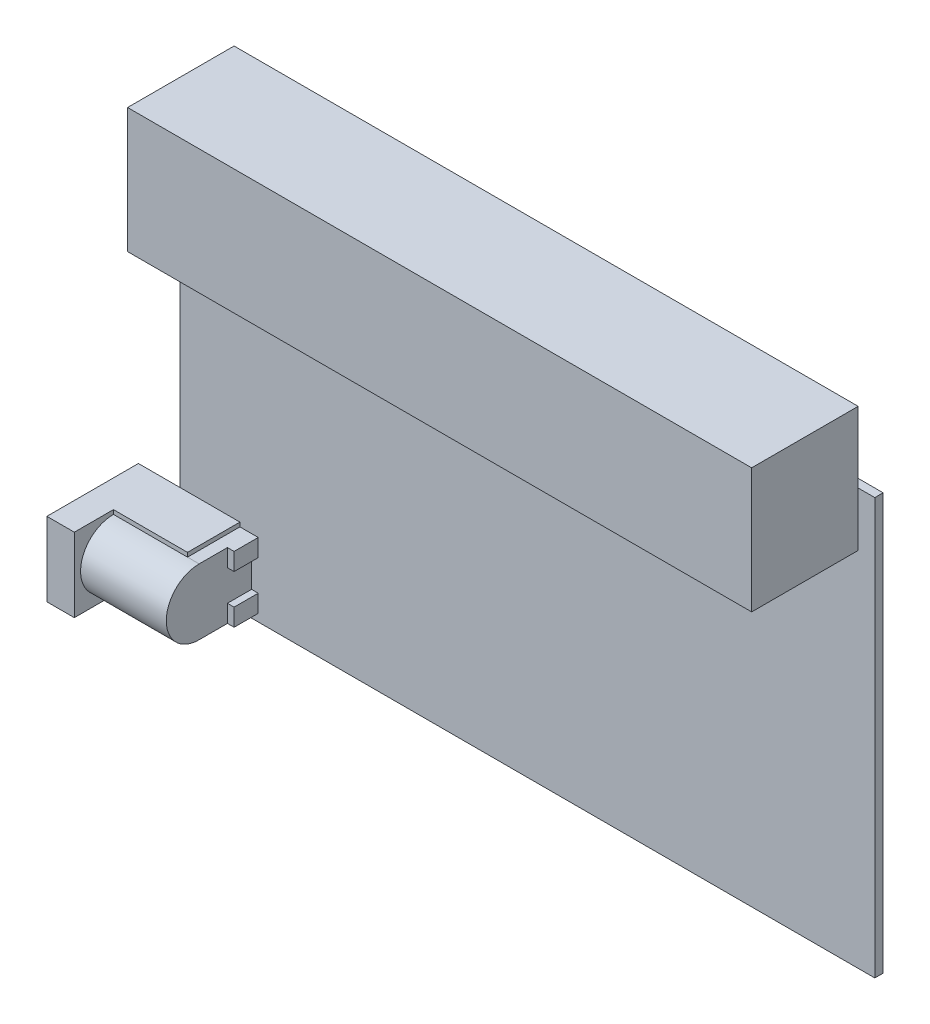
ISO-10303-21;
HEADER;
FILE_DESCRIPTION(('STEP AP214'),'2;1');
FILE_NAME('part.step','',(''),(''),'','','');
FILE_SCHEMA(('AUTOMOTIVE_DESIGN { 1 0 10303 214 1 1 1 1 }'));
ENDSEC;
DATA;
#1=APPLICATION_CONTEXT('core data for automotive mechanical design processes');
#2=APPLICATION_PROTOCOL_DEFINITION('international standard','automotive_design',2000,#1);
#3=PRODUCT_CONTEXT('',#1,'mechanical');
#4=PRODUCT('Part','Part','',(#3));
#5=PRODUCT_RELATED_PRODUCT_CATEGORY('part','',(#4));
#6=PRODUCT_DEFINITION_FORMATION('','',#4);
#7=PRODUCT_DEFINITION_CONTEXT('part definition',#1,'design');
#8=PRODUCT_DEFINITION('design','',#6,#7);
#9=PRODUCT_DEFINITION_SHAPE('','',#8);
#10=(LENGTH_UNIT() NAMED_UNIT(*) SI_UNIT(.MILLI.,.METRE.));
#11=(NAMED_UNIT(*) PLANE_ANGLE_UNIT() SI_UNIT($,.RADIAN.));
#12=(NAMED_UNIT(*) SI_UNIT($,.STERADIAN.) SOLID_ANGLE_UNIT());
#13=UNCERTAINTY_MEASURE_WITH_UNIT(LENGTH_MEASURE(1.E-05),#10,'distance_accuracy_value','');
#14=(GEOMETRIC_REPRESENTATION_CONTEXT(3) GLOBAL_UNCERTAINTY_ASSIGNED_CONTEXT((#13)) GLOBAL_UNIT_ASSIGNED_CONTEXT((#10,
#11,#12)) REPRESENTATION_CONTEXT('',''));
#15=CARTESIAN_POINT('',(0.,0.,0.));
#16=DIRECTION('',(0.,0.,1.));
#17=DIRECTION('',(1.,0.,0.));
#18=AXIS2_PLACEMENT_3D('',#15,#16,#17);
#19=CARTESIAN_POINT('',(0.,0.,1.));
#20=DIRECTION('',(0.,0.,1.));
#21=DIRECTION('',(1.,0.,0.));
#22=AXIS2_PLACEMENT_3D('',#19,#20,#21);
#23=PLANE('',#22);
#24=DIRECTION('',(0.,1.,0.));
#25=VECTOR('',#24,1.);
#26=CARTESIAN_POINT('',(-32.35,-18.3,1.));
#27=LINE('',#26,#25);
#28=CARTESIAN_POINT('',(-32.35,-18.3,1.));
#29=VERTEX_POINT('',#28);
#30=CARTESIAN_POINT('',(-32.35,-16.2,1.));
#31=VERTEX_POINT('',#30);
#32=EDGE_CURVE('E52',#29,#31,#27,.T.);
#33=ORIENTED_EDGE('',*,*,#32,.F.);
#34=DIRECTION('',(-1.,0.,0.));
#35=VECTOR('',#34,1.);
#36=CARTESIAN_POINT('',(-32.35,-18.3,1.));
#37=LINE('',#36,#35);
#38=CARTESIAN_POINT('',(-33.15,-18.3,1.));
#39=VERTEX_POINT('',#38);
#40=EDGE_CURVE('E222',#29,#39,#37,.T.);
#41=ORIENTED_EDGE('',*,*,#40,.T.);
#42=DIRECTION('',(0.,1.,0.));
#43=VECTOR('',#42,1.);
#44=CARTESIAN_POINT('',(-33.15,-16.2,1.));
#45=LINE('',#44,#43);
#46=CARTESIAN_POINT('',(-33.15,-22.,1.));
#47=VERTEX_POINT('',#46);
#48=EDGE_CURVE('E344',#47,#39,#45,.T.);
#49=ORIENTED_EDGE('',*,*,#48,.F.);
#50=DIRECTION('',(-1.,0.,0.));
#51=VECTOR('',#50,1.);
#52=CARTESIAN_POINT('',(-32.35,-22.,1.));
#53=LINE('',#52,#51);
#54=CARTESIAN_POINT('',(-32.35,-22.,1.));
#55=VERTEX_POINT('',#54);
#56=EDGE_CURVE('E263',#55,#47,#53,.T.);
#57=ORIENTED_EDGE('',*,*,#56,.F.);
#58=DIRECTION('',(0.,1.,0.));
#59=VECTOR('',#58,1.);
#60=CARTESIAN_POINT('',(-32.35,-22.,1.));
#61=LINE('',#60,#59);
#62=CARTESIAN_POINT('',(-32.35,-24.1,1.));
#63=VERTEX_POINT('',#62);
#64=EDGE_CURVE('E253',#63,#55,#61,.T.);
#65=ORIENTED_EDGE('',*,*,#64,.F.);
#66=DIRECTION('',(-1.,0.,0.));
#67=VECTOR('',#66,1.);
#68=CARTESIAN_POINT('',(-33.15,-24.1,1.));
#69=LINE('',#68,#67);
#70=CARTESIAN_POINT('',(-34.55,-24.1,1.));
#71=VERTEX_POINT('',#70);
#72=EDGE_CURVE('E355',#63,#71,#69,.T.);
#73=ORIENTED_EDGE('',*,*,#72,.T.);
#74=DIRECTION('',(0.,1.,0.));
#75=VECTOR('',#74,1.);
#76=CARTESIAN_POINT('',(-34.55,-24.6,1.));
#77=LINE('',#76,#75);
#78=CARTESIAN_POINT('',(-34.55,-24.6,1.));
#79=VERTEX_POINT('',#78);
#80=EDGE_CURVE('E305',#79,#71,#77,.T.);
#81=ORIENTED_EDGE('',*,*,#80,.F.);
#82=DIRECTION('',(1.,0.,0.));
#83=VECTOR('',#82,1.);
#84=CARTESIAN_POINT('',(-43.45,-24.6,1.));
#85=LINE('',#84,#83);
#86=CARTESIAN_POINT('',(-41.75,-24.6,1.));
#87=VERTEX_POINT('',#86);
#88=EDGE_CURVE('E292',#87,#79,#85,.T.);
#89=ORIENTED_EDGE('',*,*,#88,.F.);
#90=DIRECTION('',(0.,-1.,0.));
#91=VECTOR('',#90,1.);
#92=CARTESIAN_POINT('',(-41.75,25.,1.));
#93=LINE('',#92,#91);
#94=CARTESIAN_POINT('',(-41.75,-25.,1.));
#95=VERTEX_POINT('',#94);
#96=EDGE_CURVE('E398',#87,#95,#93,.T.);
#97=ORIENTED_EDGE('',*,*,#96,.T.);
#98=DIRECTION('',(1.,0.,0.));
#99=VECTOR('',#98,1.);
#100=CARTESIAN_POINT('',(-41.75,-25.,1.));
#101=LINE('',#100,#99);
#102=CARTESIAN_POINT('',(41.75,-25.,1.));
#103=VERTEX_POINT('',#102);
#104=EDGE_CURVE('E396',#95,#103,#101,.T.);
#105=ORIENTED_EDGE('',*,*,#104,.T.);
#106=DIRECTION('',(0.,1.,0.));
#107=VECTOR('',#106,1.);
#108=CARTESIAN_POINT('',(41.75,25.,1.));
#109=LINE('',#108,#107);
#110=CARTESIAN_POINT('',(41.75,25.,1.));
#111=VERTEX_POINT('',#110);
#112=EDGE_CURVE('E400',#103,#111,#109,.T.);
#113=ORIENTED_EDGE('',*,*,#112,.T.);
#114=DIRECTION('',(-1.,0.,0.));
#115=VECTOR('',#114,1.);
#116=CARTESIAN_POINT('',(-41.75,25.,1.));
#117=LINE('',#116,#115);
#118=CARTESIAN_POINT('',(39.75,25.,1.));
#119=VERTEX_POINT('',#118);
#120=EDGE_CURVE('E403',#111,#119,#117,.T.);
#121=ORIENTED_EDGE('',*,*,#120,.T.);
#122=DIRECTION('',(0.,1.,0.));
#123=VECTOR('',#122,1.);
#124=CARTESIAN_POINT('',(39.75,33.5,1.));
#125=LINE('',#124,#123);
#126=CARTESIAN_POINT('',(39.75,18.5,1.));
#127=VERTEX_POINT('',#126);
#128=EDGE_CURVE('E377',#127,#119,#125,.T.);
#129=ORIENTED_EDGE('',*,*,#128,.F.);
#130=DIRECTION('',(1.,0.,0.));
#131=VECTOR('',#130,1.);
#132=CARTESIAN_POINT('',(-35.25,18.5,1.));
#133=LINE('',#132,#131);
#134=CARTESIAN_POINT('',(-35.25,18.5,1.));
#135=VERTEX_POINT('',#134);
#136=EDGE_CURVE('E373',#135,#127,#133,.T.);
#137=ORIENTED_EDGE('',*,*,#136,.F.);
#138=DIRECTION('',(0.,-1.,0.));
#139=VECTOR('',#138,1.);
#140=CARTESIAN_POINT('',(-35.25,33.5,1.));
#141=LINE('',#140,#139);
#142=CARTESIAN_POINT('',(-35.25,25.,1.));
#143=VERTEX_POINT('',#142);
#144=EDGE_CURVE('E11',#143,#135,#141,.T.);
#145=ORIENTED_EDGE('',*,*,#144,.F.);
#146=CARTESIAN_POINT('',(-41.75,25.,1.));
#147=VERTEX_POINT('',#146);
#148=EDGE_CURVE('E402',#143,#147,#117,.T.);
#149=ORIENTED_EDGE('',*,*,#148,.T.);
#150=CARTESIAN_POINT('',(-41.75,-15.7,1.));
#151=VERTEX_POINT('',#150);
#152=EDGE_CURVE('E393',#147,#151,#93,.T.);
#153=ORIENTED_EDGE('',*,*,#152,.T.);
#154=DIRECTION('',(-1.,0.,0.));
#155=VECTOR('',#154,1.);
#156=CARTESIAN_POINT('',(0.,-15.7,1.));
#157=LINE('',#156,#155);
#158=CARTESIAN_POINT('',(-34.55,-15.7,1.));
#159=VERTEX_POINT('',#158);
#160=EDGE_CURVE('E276',#159,#151,#157,.T.);
#161=ORIENTED_EDGE('',*,*,#160,.F.);
#162=DIRECTION('',(0.,-1.,0.));
#163=VECTOR('',#162,1.);
#164=CARTESIAN_POINT('',(-34.55,-15.7,1.));
#165=LINE('',#164,#163);
#166=CARTESIAN_POINT('',(-34.55,-16.2,1.));
#167=VERTEX_POINT('',#166);
#168=EDGE_CURVE('E284',#159,#167,#165,.T.);
#169=ORIENTED_EDGE('',*,*,#168,.T.);
#170=DIRECTION('',(-1.,0.,0.));
#171=VECTOR('',#170,1.);
#172=CARTESIAN_POINT('',(-33.15,-16.2,1.));
#173=LINE('',#172,#171);
#174=EDGE_CURVE('E57',#31,#167,#173,.T.);
#175=ORIENTED_EDGE('',*,*,#174,.F.);
#176=EDGE_LOOP('',(#33,#41,#49,#57,#65,#73,#81,#89,#97,#105,#113,#121,#129,#137,#145,#149,#153,
#161,#169,#175));
#177=FACE_BOUND('',#176,.T.);
#178=ADVANCED_FACE('F35',(#177),#23,.T.);
#179=CARTESIAN_POINT('',(-33.15,-20.15,7.3));
#180=DIRECTION('',(-1.,0.,0.));
#181=DIRECTION('',(0.,0.,1.));
#182=AXIS2_PLACEMENT_3D('',#179,#180,#181);
#183=PLANE('',#182);
#184=DIRECTION('',(0.,-1.,0.));
#185=VECTOR('',#184,1.);
#186=CARTESIAN_POINT('',(-33.15,-18.3,3.9));
#187=LINE('',#186,#185);
#188=CARTESIAN_POINT('',(-33.15,-16.2,3.9));
#189=VERTEX_POINT('',#188);
#190=CARTESIAN_POINT('',(-33.15,-18.3,3.9));
#191=VERTEX_POINT('',#190);
#192=EDGE_CURVE('E237',#189,#191,#187,.T.);
#193=ORIENTED_EDGE('',*,*,#192,.F.);
#194=DIRECTION('',(0.,0.,1.));
#195=VECTOR('',#194,1.);
#196=CARTESIAN_POINT('',(-33.15,-16.2,7.3));
#197=LINE('',#196,#195);
#198=CARTESIAN_POINT('',(-33.15,-16.2,7.3));
#199=VERTEX_POINT('',#198);
#200=EDGE_CURVE('E347',#189,#199,#197,.T.);
#201=ORIENTED_EDGE('',*,*,#200,.T.);
#202=CARTESIAN_POINT('',(-33.15,-20.15,7.3));
#203=DIRECTION('',(1.,0.,0.));
#204=DIRECTION('',(0.,0.,1.));
#205=AXIS2_PLACEMENT_3D('',#202,#203,#204);
#206=CIRCLE('',#205,3.95);
#207=CARTESIAN_POINT('',(-33.15,-24.1,7.3));
#208=VERTEX_POINT('',#207);
#209=EDGE_CURVE('E339',#199,#208,#206,.T.);
#210=ORIENTED_EDGE('',*,*,#209,.T.);
#211=DIRECTION('',(0.,0.,-1.));
#212=VECTOR('',#211,1.);
#213=CARTESIAN_POINT('',(-33.15,-24.1,7.3));
#214=LINE('',#213,#212);
#215=CARTESIAN_POINT('',(-33.15,-24.1,3.9));
#216=VERTEX_POINT('',#215);
#217=EDGE_CURVE('E342',#208,#216,#214,.T.);
#218=ORIENTED_EDGE('',*,*,#217,.T.);
#219=DIRECTION('',(0.,-1.,0.));
#220=VECTOR('',#219,1.);
#221=CARTESIAN_POINT('',(-33.15,-22.,3.9));
#222=LINE('',#221,#220);
#223=CARTESIAN_POINT('',(-33.15,-22.,3.9));
#224=VERTEX_POINT('',#223);
#225=EDGE_CURVE('E238',#224,#216,#222,.T.);
#226=ORIENTED_EDGE('',*,*,#225,.F.);
#227=DIRECTION('',(0.,0.,1.));
#228=VECTOR('',#227,1.);
#229=CARTESIAN_POINT('',(-33.15,-22.,3.9));
#230=LINE('',#229,#228);
#231=EDGE_CURVE('E241',#47,#224,#230,.T.);
#232=ORIENTED_EDGE('',*,*,#231,.F.);
#233=ORIENTED_EDGE('',*,*,#48,.T.);
#234=DIRECTION('',(0.,0.,-1.));
#235=VECTOR('',#234,1.);
#236=CARTESIAN_POINT('',(-33.15,-18.3,3.9));
#237=LINE('',#236,#235);
#238=EDGE_CURVE('E233',#191,#39,#237,.T.);
#239=ORIENTED_EDGE('',*,*,#238,.F.);
#240=EDGE_LOOP('',(#193,#201,#210,#218,#226,#232,#233,#239));
#241=FACE_BOUND('',#240,.T.);
#242=ADVANCED_FACE('F482',(#241),#183,.F.);
#243=CARTESIAN_POINT('',(-43.45,0.,12.));
#244=DIRECTION('',(1.,0.,0.));
#245=DIRECTION('',(0.,0.,-1.));
#246=AXIS2_PLACEMENT_3D('',#243,#244,#245);
#247=PLANE('',#246);
#248=CARTESIAN_POINT('',(-43.45,-20.15,7.3));
#249=DIRECTION('',(1.,0.,0.));
#250=DIRECTION('',(0.,0.,1.));
#251=AXIS2_PLACEMENT_3D('',#248,#249,#250);
#252=CIRCLE('',#251,3.95);
#253=CARTESIAN_POINT('',(-43.45,-16.2,7.3));
#254=VERTEX_POINT('',#253);
#255=CARTESIAN_POINT('',(-43.45,-24.1,7.3));
#256=VERTEX_POINT('',#255);
#257=EDGE_CURVE('E338',#254,#256,#252,.T.);
#258=ORIENTED_EDGE('',*,*,#257,.F.);
#259=DIRECTION('',(0.,-1.,0.));
#260=VECTOR('',#259,1.);
#261=CARTESIAN_POINT('',(-43.45,-15.7,7.3));
#262=LINE('',#261,#260);
#263=CARTESIAN_POINT('',(-43.45,-15.7,7.3));
#264=VERTEX_POINT('',#263);
#265=EDGE_CURVE('E279',#264,#254,#262,.T.);
#266=ORIENTED_EDGE('',*,*,#265,.F.);
#267=DIRECTION('',(0.,0.,-1.));
#268=VECTOR('',#267,1.);
#269=CARTESIAN_POINT('',(-43.45,-15.7,12.));
#270=LINE('',#269,#268);
#271=CARTESIAN_POINT('',(-43.45,-15.7,12.));
#272=VERTEX_POINT('',#271);
#273=EDGE_CURVE('E335',#272,#264,#270,.T.);
#274=ORIENTED_EDGE('',*,*,#273,.F.);
#275=DIRECTION('',(0.,-1.,0.));
#276=VECTOR('',#275,1.);
#277=CARTESIAN_POINT('',(-43.45,0.,12.));
#278=LINE('',#277,#276);
#279=CARTESIAN_POINT('',(-43.45,-24.6,12.));
#280=VERTEX_POINT('',#279);
#281=EDGE_CURVE('E311',#272,#280,#278,.T.);
#282=ORIENTED_EDGE('',*,*,#281,.T.);
#283=DIRECTION('',(0.,0.,-1.));
#284=VECTOR('',#283,1.);
#285=CARTESIAN_POINT('',(-43.45,-24.6,12.));
#286=LINE('',#285,#284);
#287=CARTESIAN_POINT('',(-43.45,-24.6,7.3));
#288=VERTEX_POINT('',#287);
#289=EDGE_CURVE('E322',#280,#288,#286,.T.);
#290=ORIENTED_EDGE('',*,*,#289,.T.);
#291=DIRECTION('',(0.,1.,0.));
#292=VECTOR('',#291,1.);
#293=CARTESIAN_POINT('',(-43.45,-24.6,7.3));
#294=LINE('',#293,#292);
#295=EDGE_CURVE('E308',#288,#256,#294,.T.);
#296=ORIENTED_EDGE('',*,*,#295,.T.);
#297=EDGE_LOOP('',(#258,#266,#274,#282,#290,#296));
#298=FACE_BOUND('',#297,.T.);
#299=ADVANCED_FACE('F487',(#298),#247,.T.);
#300=CARTESIAN_POINT('',(-33.15,-16.2,7.3));
#301=DIRECTION('',(0.,-1.,0.));
#302=DIRECTION('',(0.,0.,-1.));
#303=AXIS2_PLACEMENT_3D('',#300,#301,#302);
#304=PLANE('',#303);
#305=DIRECTION('',(0.,0.,-1.));
#306=VECTOR('',#305,1.);
#307=CARTESIAN_POINT('',(-34.55,-16.2,0.));
#308=LINE('',#307,#306);
#309=CARTESIAN_POINT('',(-34.55,-16.2,7.3));
#310=VERTEX_POINT('',#309);
#311=EDGE_CURVE('E274',#310,#167,#308,.T.);
#312=ORIENTED_EDGE('',*,*,#311,.F.);
#313=DIRECTION('',(-1.,0.,0.));
#314=VECTOR('',#313,1.);
#315=CARTESIAN_POINT('',(-33.15,-16.2,7.3));
#316=LINE('',#315,#314);
#317=EDGE_CURVE('E349',#199,#310,#316,.T.);
#318=ORIENTED_EDGE('',*,*,#317,.F.);
#319=ORIENTED_EDGE('',*,*,#200,.F.);
#320=DIRECTION('',(-1.,0.,0.));
#321=VECTOR('',#320,1.);
#322=CARTESIAN_POINT('',(-32.35,-16.2,3.9));
#323=LINE('',#322,#321);
#324=CARTESIAN_POINT('',(-32.35,-16.2,3.9));
#325=VERTEX_POINT('',#324);
#326=EDGE_CURVE('E243',#325,#189,#323,.T.);
#327=ORIENTED_EDGE('',*,*,#326,.F.);
#328=DIRECTION('',(0.,0.,1.));
#329=VECTOR('',#328,1.);
#330=CARTESIAN_POINT('',(-32.35,-16.2,3.9));
#331=LINE('',#330,#329);
#332=EDGE_CURVE('E229',#31,#325,#331,.T.);
#333=ORIENTED_EDGE('',*,*,#332,.F.);
#334=ORIENTED_EDGE('',*,*,#174,.T.);
#335=EDGE_LOOP('',(#312,#318,#319,#327,#333,#334));
#336=FACE_BOUND('',#335,.T.);
#337=ADVANCED_FACE('F506',(#336),#304,.F.);
#338=CARTESIAN_POINT('',(-33.15,-24.1,7.3));
#339=DIRECTION('',(0.,1.,0.));
#340=DIRECTION('',(0.,0.,1.));
#341=AXIS2_PLACEMENT_3D('',#338,#339,#340);
#342=PLANE('',#341);
#343=DIRECTION('',(0.,0.,1.));
#344=VECTOR('',#343,1.);
#345=CARTESIAN_POINT('',(-34.55,-24.1,7.3));
#346=LINE('',#345,#344);
#347=CARTESIAN_POINT('',(-34.55,-24.1,7.3));
#348=VERTEX_POINT('',#347);
#349=EDGE_CURVE('E293',#71,#348,#346,.T.);
#350=ORIENTED_EDGE('',*,*,#349,.F.);
#351=ORIENTED_EDGE('',*,*,#72,.F.);
#352=DIRECTION('',(0.,0.,-1.));
#353=VECTOR('',#352,1.);
#354=CARTESIAN_POINT('',(-32.35,-24.1,3.9));
#355=LINE('',#354,#353);
#356=CARTESIAN_POINT('',(-32.35,-24.1,3.9));
#357=VERTEX_POINT('',#356);
#358=EDGE_CURVE('E250',#357,#63,#355,.T.);
#359=ORIENTED_EDGE('',*,*,#358,.F.);
#360=DIRECTION('',(-1.,0.,0.));
#361=VECTOR('',#360,1.);
#362=CARTESIAN_POINT('',(-32.35,-24.1,3.9));
#363=LINE('',#362,#361);
#364=EDGE_CURVE('E266',#357,#216,#363,.T.);
#365=ORIENTED_EDGE('',*,*,#364,.T.);
#366=ORIENTED_EDGE('',*,*,#217,.F.);
#367=DIRECTION('',(-1.,0.,0.));
#368=VECTOR('',#367,1.);
#369=CARTESIAN_POINT('',(-33.15,-24.1,7.3));
#370=LINE('',#369,#368);
#371=EDGE_CURVE('E358',#208,#348,#370,.T.);
#372=ORIENTED_EDGE('',*,*,#371,.T.);
#373=EDGE_LOOP('',(#350,#351,#359,#365,#366,#372));
#374=FACE_BOUND('',#373,.T.);
#375=ADVANCED_FACE('F502',(#374),#342,.F.);
#376=CARTESIAN_POINT('',(-41.75,25.,1.));
#377=DIRECTION('',(1.,0.,0.));
#378=DIRECTION('',(0.,1.,0.));
#379=AXIS2_PLACEMENT_3D('',#376,#377,#378);
#380=PLANE('',#379);
#381=DIRECTION('',(0.,-1.,0.));
#382=VECTOR('',#381,1.);
#383=CARTESIAN_POINT('',(-41.75,25.,0.));
#384=LINE('',#383,#382);
#385=CARTESIAN_POINT('',(-41.75,25.,0.));
#386=VERTEX_POINT('',#385);
#387=CARTESIAN_POINT('',(-41.75,-25.,0.));
#388=VERTEX_POINT('',#387);
#389=EDGE_CURVE('E392',#386,#388,#384,.T.);
#390=ORIENTED_EDGE('',*,*,#389,.T.);
#391=DIRECTION('',(0.,0.,-1.));
#392=VECTOR('',#391,1.);
#393=CARTESIAN_POINT('',(-41.75,-25.,1.));
#394=LINE('',#393,#392);
#395=EDGE_CURVE('E39',#95,#388,#394,.T.);
#396=ORIENTED_EDGE('',*,*,#395,.F.);
#397=ORIENTED_EDGE('',*,*,#96,.F.);
#398=EDGE_CURVE('E397',#151,#87,#93,.T.);
#399=ORIENTED_EDGE('',*,*,#398,.F.);
#400=ORIENTED_EDGE('',*,*,#152,.F.);
#401=DIRECTION('',(0.,0.,-1.));
#402=VECTOR('',#401,1.);
#403=CARTESIAN_POINT('',(-41.75,25.,1.));
#404=LINE('',#403,#402);
#405=EDGE_CURVE('E406',#147,#386,#404,.T.);
#406=ORIENTED_EDGE('',*,*,#405,.T.);
#407=EDGE_LOOP('',(#390,#396,#397,#399,#400,#406));
#408=FACE_BOUND('',#407,.T.);
#409=ADVANCED_FACE('F37',(#408),#380,.F.);
#410=CARTESIAN_POINT('',(-41.75,-25.,1.));
#411=DIRECTION('',(0.,1.,0.));
#412=DIRECTION('',(0.,0.,1.));
#413=AXIS2_PLACEMENT_3D('',#410,#411,#412);
#414=PLANE('',#413);
#415=DIRECTION('',(1.,0.,0.));
#416=VECTOR('',#415,1.);
#417=CARTESIAN_POINT('',(-41.75,-25.,0.));
#418=LINE('',#417,#416);
#419=CARTESIAN_POINT('',(41.75,-25.,0.));
#420=VERTEX_POINT('',#419);
#421=EDGE_CURVE('E410',#388,#420,#418,.T.);
#422=ORIENTED_EDGE('',*,*,#421,.T.);
#423=DIRECTION('',(0.,0.,-1.));
#424=VECTOR('',#423,1.);
#425=CARTESIAN_POINT('',(41.75,-25.,1.));
#426=LINE('',#425,#424);
#427=EDGE_CURVE('E420',#103,#420,#426,.T.);
#428=ORIENTED_EDGE('',*,*,#427,.F.);
#429=ORIENTED_EDGE('',*,*,#104,.F.);
#430=ORIENTED_EDGE('',*,*,#395,.T.);
#431=EDGE_LOOP('',(#422,#428,#429,#430));
#432=FACE_BOUND('',#431,.T.);
#433=ADVANCED_FACE('F430',(#432),#414,.F.);
#434=CARTESIAN_POINT('',(41.75,25.,1.));
#435=DIRECTION('',(-1.,0.,0.));
#436=DIRECTION('',(0.,-1.,0.));
#437=AXIS2_PLACEMENT_3D('',#434,#435,#436);
#438=PLANE('',#437);
#439=DIRECTION('',(0.,1.,0.));
#440=VECTOR('',#439,1.);
#441=CARTESIAN_POINT('',(41.75,25.,0.));
#442=LINE('',#441,#440);
#443=CARTESIAN_POINT('',(41.75,25.,0.));
#444=VERTEX_POINT('',#443);
#445=EDGE_CURVE('E412',#420,#444,#442,.T.);
#446=ORIENTED_EDGE('',*,*,#445,.T.);
#447=DIRECTION('',(0.,0.,-1.));
#448=VECTOR('',#447,1.);
#449=CARTESIAN_POINT('',(41.75,25.,1.));
#450=LINE('',#449,#448);
#451=EDGE_CURVE('E418',#111,#444,#450,.T.);
#452=ORIENTED_EDGE('',*,*,#451,.F.);
#453=ORIENTED_EDGE('',*,*,#112,.F.);
#454=ORIENTED_EDGE('',*,*,#427,.T.);
#455=EDGE_LOOP('',(#446,#452,#453,#454));
#456=FACE_BOUND('',#455,.T.);
#457=ADVANCED_FACE('F440',(#456),#438,.F.);
#458=CARTESIAN_POINT('',(-41.75,25.,1.));
#459=DIRECTION('',(0.,-1.,0.));
#460=DIRECTION('',(1.,0.,0.));
#461=AXIS2_PLACEMENT_3D('',#458,#459,#460);
#462=PLANE('',#461);
#463=DIRECTION('',(-1.,0.,0.));
#464=VECTOR('',#463,1.);
#465=CARTESIAN_POINT('',(-41.75,25.,0.));
#466=LINE('',#465,#464);
#467=EDGE_CURVE('E414',#444,#386,#466,.T.);
#468=ORIENTED_EDGE('',*,*,#467,.T.);
#469=ORIENTED_EDGE('',*,*,#405,.F.);
#470=ORIENTED_EDGE('',*,*,#148,.F.);
#471=EDGE_CURVE('E407',#119,#143,#117,.T.);
#472=ORIENTED_EDGE('',*,*,#471,.F.);
#473=ORIENTED_EDGE('',*,*,#120,.F.);
#474=ORIENTED_EDGE('',*,*,#451,.T.);
#475=EDGE_LOOP('',(#468,#469,#470,#472,#473,#474));
#476=FACE_BOUND('',#475,.T.);
#477=ADVANCED_FACE('F443',(#476),#462,.F.);
#478=CARTESIAN_POINT('',(0.,0.,0.));
#479=DIRECTION('',(0.,0.,1.));
#480=DIRECTION('',(1.,0.,0.));
#481=AXIS2_PLACEMENT_3D('',#478,#479,#480);
#482=PLANE('',#481);
#483=ORIENTED_EDGE('',*,*,#389,.F.);
#484=ORIENTED_EDGE('',*,*,#467,.F.);
#485=ORIENTED_EDGE('',*,*,#445,.F.);
#486=ORIENTED_EDGE('',*,*,#421,.F.);
#487=EDGE_LOOP('',(#483,#484,#485,#486));
#488=FACE_BOUND('',#487,.T.);
#489=ADVANCED_FACE('F438',(#488),#482,.F.);
#490=CARTESIAN_POINT('',(0.,0.,1.));
#491=DIRECTION('',(0.,0.,1.));
#492=DIRECTION('',(1.,0.,0.));
#493=AXIS2_PLACEMENT_3D('',#490,#491,#492);
#494=PLANE('',#493);
#495=CARTESIAN_POINT('',(39.75,33.5,1.));
#496=VERTEX_POINT('',#495);
#497=EDGE_CURVE('E376',#119,#496,#125,.T.);
#498=ORIENTED_EDGE('',*,*,#497,.F.);
#499=ORIENTED_EDGE('',*,*,#471,.T.);
#500=CARTESIAN_POINT('',(-35.25,33.5,1.));
#501=VERTEX_POINT('',#500);
#502=EDGE_CURVE('E45',#501,#143,#141,.T.);
#503=ORIENTED_EDGE('',*,*,#502,.F.);
#504=DIRECTION('',(-1.,0.,0.));
#505=VECTOR('',#504,1.);
#506=CARTESIAN_POINT('',(-35.25,33.5,1.));
#507=LINE('',#506,#505);
#508=EDGE_CURVE('E365',#496,#501,#507,.T.);
#509=ORIENTED_EDGE('',*,*,#508,.F.);
#510=EDGE_LOOP('',(#498,#499,#503,#509));
#511=FACE_BOUND('',#510,.T.);
#512=ADVANCED_FACE('F449',(#511),#494,.F.);
#513=CARTESIAN_POINT('',(-35.25,33.5,13.8));
#514=DIRECTION('',(1.,0.,0.));
#515=DIRECTION('',(0.,0.,-1.));
#516=AXIS2_PLACEMENT_3D('',#513,#514,#515);
#517=PLANE('',#516);
#518=ORIENTED_EDGE('',*,*,#502,.T.);
#519=ORIENTED_EDGE('',*,*,#144,.T.);
#520=DIRECTION('',(0.,0.,-1.));
#521=VECTOR('',#520,1.);
#522=CARTESIAN_POINT('',(-35.25,18.5,13.8));
#523=LINE('',#522,#521);
#524=CARTESIAN_POINT('',(-35.25,18.5,13.8));
#525=VERTEX_POINT('',#524);
#526=EDGE_CURVE('E389',#525,#135,#523,.T.);
#527=ORIENTED_EDGE('',*,*,#526,.F.);
#528=DIRECTION('',(0.,-1.,0.));
#529=VECTOR('',#528,1.);
#530=CARTESIAN_POINT('',(-35.25,33.5,13.8));
#531=LINE('',#530,#529);
#532=CARTESIAN_POINT('',(-35.25,33.5,13.8));
#533=VERTEX_POINT('',#532);
#534=EDGE_CURVE('E361',#533,#525,#531,.T.);
#535=ORIENTED_EDGE('',*,*,#534,.F.);
#536=DIRECTION('',(0.,0.,-1.));
#537=VECTOR('',#536,1.);
#538=CARTESIAN_POINT('',(-35.25,33.5,13.8));
#539=LINE('',#538,#537);
#540=EDGE_CURVE('E370',#533,#501,#539,.T.);
#541=ORIENTED_EDGE('',*,*,#540,.T.);
#542=EDGE_LOOP('',(#518,#519,#527,#535,#541));
#543=FACE_BOUND('',#542,.T.);
#544=ADVANCED_FACE('F460',(#543),#517,.F.);
#545=CARTESIAN_POINT('',(-35.25,18.5,13.8));
#546=DIRECTION('',(0.,1.,0.));
#547=DIRECTION('',(0.,0.,1.));
#548=AXIS2_PLACEMENT_3D('',#545,#546,#547);
#549=PLANE('',#548);
#550=ORIENTED_EDGE('',*,*,#136,.T.);
#551=DIRECTION('',(0.,0.,-1.));
#552=VECTOR('',#551,1.);
#553=CARTESIAN_POINT('',(39.75,18.5,13.8));
#554=LINE('',#553,#552);
#555=CARTESIAN_POINT('',(39.75,18.5,13.8));
#556=VERTEX_POINT('',#555);
#557=EDGE_CURVE('E386',#556,#127,#554,.T.);
#558=ORIENTED_EDGE('',*,*,#557,.F.);
#559=DIRECTION('',(1.,0.,0.));
#560=VECTOR('',#559,1.);
#561=CARTESIAN_POINT('',(-35.25,18.5,13.8));
#562=LINE('',#561,#560);
#563=EDGE_CURVE('E364',#525,#556,#562,.T.);
#564=ORIENTED_EDGE('',*,*,#563,.F.);
#565=ORIENTED_EDGE('',*,*,#526,.T.);
#566=EDGE_LOOP('',(#550,#558,#564,#565));
#567=FACE_BOUND('',#566,.T.);
#568=ADVANCED_FACE('F457',(#567),#549,.F.);
#569=CARTESIAN_POINT('',(39.75,33.5,13.8));
#570=DIRECTION('',(-1.,0.,0.));
#571=DIRECTION('',(0.,-1.,0.));
#572=AXIS2_PLACEMENT_3D('',#569,#570,#571);
#573=PLANE('',#572);
#574=ORIENTED_EDGE('',*,*,#128,.T.);
#575=ORIENTED_EDGE('',*,*,#497,.T.);
#576=DIRECTION('',(0.,0.,-1.));
#577=VECTOR('',#576,1.);
#578=CARTESIAN_POINT('',(39.75,33.5,13.8));
#579=LINE('',#578,#577);
#580=CARTESIAN_POINT('',(39.75,33.5,13.8));
#581=VERTEX_POINT('',#580);
#582=EDGE_CURVE('E383',#581,#496,#579,.T.);
#583=ORIENTED_EDGE('',*,*,#582,.F.);
#584=DIRECTION('',(0.,1.,0.));
#585=VECTOR('',#584,1.);
#586=CARTESIAN_POINT('',(39.75,33.5,13.8));
#587=LINE('',#586,#585);
#588=EDGE_CURVE('E367',#556,#581,#587,.T.);
#589=ORIENTED_EDGE('',*,*,#588,.F.);
#590=ORIENTED_EDGE('',*,*,#557,.T.);
#591=EDGE_LOOP('',(#574,#575,#583,#589,#590));
#592=FACE_BOUND('',#591,.T.);
#593=ADVANCED_FACE('F453',(#592),#573,.F.);
#594=CARTESIAN_POINT('',(-35.25,33.5,13.8));
#595=DIRECTION('',(0.,-1.,0.));
#596=DIRECTION('',(0.,0.,-1.));
#597=AXIS2_PLACEMENT_3D('',#594,#595,#596);
#598=PLANE('',#597);
#599=ORIENTED_EDGE('',*,*,#508,.T.);
#600=ORIENTED_EDGE('',*,*,#540,.F.);
#601=DIRECTION('',(-1.,0.,0.));
#602=VECTOR('',#601,1.);
#603=CARTESIAN_POINT('',(-35.25,33.5,13.8));
#604=LINE('',#603,#602);
#605=EDGE_CURVE('E369',#581,#533,#604,.T.);
#606=ORIENTED_EDGE('',*,*,#605,.F.);
#607=ORIENTED_EDGE('',*,*,#582,.T.);
#608=EDGE_LOOP('',(#599,#600,#606,#607));
#609=FACE_BOUND('',#608,.T.);
#610=ADVANCED_FACE('F465',(#609),#598,.F.);
#611=CARTESIAN_POINT('',(0.,0.,13.8));
#612=DIRECTION('',(0.,0.,1.));
#613=DIRECTION('',(1.,0.,0.));
#614=AXIS2_PLACEMENT_3D('',#611,#612,#613);
#615=PLANE('',#614);
#616=ORIENTED_EDGE('',*,*,#534,.T.);
#617=ORIENTED_EDGE('',*,*,#563,.T.);
#618=ORIENTED_EDGE('',*,*,#588,.T.);
#619=ORIENTED_EDGE('',*,*,#605,.T.);
#620=EDGE_LOOP('',(#616,#617,#618,#619));
#621=FACE_BOUND('',#620,.T.);
#622=ADVANCED_FACE('F467',(#621),#615,.T.);
#623=CARTESIAN_POINT('',(-33.15,-16.2,1.));
#624=DIRECTION('',(0.,0.,1.));
#625=DIRECTION('',(1.,0.,0.));
#626=AXIS2_PLACEMENT_3D('',#623,#624,#625);
#627=PLANE('',#626);
#628=DIRECTION('',(1.,0.,0.));
#629=VECTOR('',#628,1.);
#630=CARTESIAN_POINT('',(0.,-15.7,1.));
#631=LINE('',#630,#629);
#632=CARTESIAN_POINT('',(-46.75,-15.7,1.));
#633=VERTEX_POINT('',#632);
#634=EDGE_CURVE('E310',#633,#151,#631,.T.);
#635=ORIENTED_EDGE('',*,*,#634,.T.);
#636=ORIENTED_EDGE('',*,*,#398,.T.);
#637=DIRECTION('',(1.,0.,0.));
#638=VECTOR('',#637,1.);
#639=CARTESIAN_POINT('',(0.,-24.6,1.));
#640=LINE('',#639,#638);
#641=CARTESIAN_POINT('',(-46.75,-24.6,1.));
#642=VERTEX_POINT('',#641);
#643=EDGE_CURVE('E315',#642,#87,#640,.T.);
#644=ORIENTED_EDGE('',*,*,#643,.F.);
#645=DIRECTION('',(0.,-1.,0.));
#646=VECTOR('',#645,1.);
#647=CARTESIAN_POINT('',(-46.75,0.,1.));
#648=LINE('',#647,#646);
#649=EDGE_CURVE('E325',#633,#642,#648,.T.);
#650=ORIENTED_EDGE('',*,*,#649,.F.);
#651=EDGE_LOOP('',(#635,#636,#644,#650));
#652=FACE_BOUND('',#651,.T.);
#653=ADVANCED_FACE('F469',(#652),#627,.F.);
#654=CARTESIAN_POINT('',(-33.15,-20.15,7.3));
#655=DIRECTION('',(-1.,0.,0.));
#656=DIRECTION('',(0.,0.,1.));
#657=AXIS2_PLACEMENT_3D('',#654,#655,#656);
#658=CYLINDRICAL_SURFACE('',#657,3.95);
#659=ORIENTED_EDGE('',*,*,#257,.T.);
#660=DIRECTION('',(-1.,0.,0.));
#661=VECTOR('',#660,1.);
#662=CARTESIAN_POINT('',(-34.55,-24.1,7.3));
#663=LINE('',#662,#661);
#664=EDGE_CURVE('E288',#348,#256,#663,.T.);
#665=ORIENTED_EDGE('',*,*,#664,.F.);
#666=ORIENTED_EDGE('',*,*,#371,.F.);
#667=ORIENTED_EDGE('',*,*,#209,.F.);
#668=ORIENTED_EDGE('',*,*,#317,.T.);
#669=DIRECTION('',(1.,0.,0.));
#670=VECTOR('',#669,1.);
#671=CARTESIAN_POINT('',(0.,-16.2,7.3));
#672=LINE('',#671,#670);
#673=EDGE_CURVE('E269',#254,#310,#672,.T.);
#674=ORIENTED_EDGE('',*,*,#673,.F.);
#675=EDGE_LOOP('',(#659,#665,#666,#667,#668,#674));
#676=FACE_BOUND('',#675,.T.);
#677=ADVANCED_FACE('F475',(#676),#658,.T.);
#678=CARTESIAN_POINT('',(0.,-15.7,12.));
#679=DIRECTION('',(0.,1.,0.));
#680=DIRECTION('',(0.,0.,1.));
#681=AXIS2_PLACEMENT_3D('',#678,#679,#680);
#682=PLANE('',#681);
#683=ORIENTED_EDGE('',*,*,#634,.F.);
#684=DIRECTION('',(0.,0.,-1.));
#685=VECTOR('',#684,1.);
#686=CARTESIAN_POINT('',(-46.75,-15.7,12.));
#687=LINE('',#686,#685);
#688=CARTESIAN_POINT('',(-46.75,-15.7,12.));
#689=VERTEX_POINT('',#688);
#690=EDGE_CURVE('E333',#689,#633,#687,.T.);
#691=ORIENTED_EDGE('',*,*,#690,.F.);
#692=DIRECTION('',(1.,0.,0.));
#693=VECTOR('',#692,1.);
#694=CARTESIAN_POINT('',(0.,-15.7,12.));
#695=LINE('',#694,#693);
#696=EDGE_CURVE('E314',#689,#272,#695,.T.);
#697=ORIENTED_EDGE('',*,*,#696,.T.);
#698=ORIENTED_EDGE('',*,*,#273,.T.);
#699=DIRECTION('',(1.,0.,0.));
#700=VECTOR('',#699,1.);
#701=CARTESIAN_POINT('',(0.,-15.7,7.3));
#702=LINE('',#701,#700);
#703=CARTESIAN_POINT('',(-34.55,-15.7,7.3));
#704=VERTEX_POINT('',#703);
#705=EDGE_CURVE('E270',#264,#704,#702,.T.);
#706=ORIENTED_EDGE('',*,*,#705,.T.);
#707=DIRECTION('',(0.,0.,-1.));
#708=VECTOR('',#707,1.);
#709=CARTESIAN_POINT('',(-34.55,-15.7,0.));
#710=LINE('',#709,#708);
#711=EDGE_CURVE('E273',#704,#159,#710,.T.);
#712=ORIENTED_EDGE('',*,*,#711,.T.);
#713=ORIENTED_EDGE('',*,*,#160,.T.);
#714=EDGE_LOOP('',(#683,#691,#697,#698,#706,#712,#713));
#715=FACE_BOUND('',#714,.T.);
#716=ADVANCED_FACE('F515',(#715),#682,.T.);
#717=CARTESIAN_POINT('',(-46.75,0.,12.));
#718=DIRECTION('',(1.,0.,0.));
#719=DIRECTION('',(0.,0.,-1.));
#720=AXIS2_PLACEMENT_3D('',#717,#718,#719);
#721=PLANE('',#720);
#722=CARTESIAN_POINT('',(-46.75,-20.15,7.3));
#723=DIRECTION('',(-1.,0.,0.));
#724=DIRECTION('',(0.,0.,1.));
#725=AXIS2_PLACEMENT_3D('',#722,#723,#724);
#726=CIRCLE('',#725,2.25);
#727=CARTESIAN_POINT('',(-46.75,-20.15,9.55));
#728=VERTEX_POINT('',#727);
#729=EDGE_CURVE('E675',#728,#728,#726,.T.);
#730=ORIENTED_EDGE('',*,*,#729,.F.);
#731=EDGE_LOOP('',(#730));
#732=FACE_BOUND('',#731,.T.);
#733=ORIENTED_EDGE('',*,*,#649,.T.);
#734=DIRECTION('',(0.,0.,-1.));
#735=VECTOR('',#734,1.);
#736=CARTESIAN_POINT('',(-46.75,-24.6,12.));
#737=LINE('',#736,#735);
#738=CARTESIAN_POINT('',(-46.75,-24.6,12.));
#739=VERTEX_POINT('',#738);
#740=EDGE_CURVE('E330',#739,#642,#737,.T.);
#741=ORIENTED_EDGE('',*,*,#740,.F.);
#742=DIRECTION('',(0.,-1.,0.));
#743=VECTOR('',#742,1.);
#744=CARTESIAN_POINT('',(-46.75,0.,12.));
#745=LINE('',#744,#743);
#746=EDGE_CURVE('E318',#689,#739,#745,.T.);
#747=ORIENTED_EDGE('',*,*,#746,.F.);
#748=ORIENTED_EDGE('',*,*,#690,.T.);
#749=EDGE_LOOP('',(#733,#741,#747,#748));
#750=FACE_BOUND('',#749,.T.);
#751=ADVANCED_FACE('F520',(#732,#750),#721,.F.);
#752=CARTESIAN_POINT('',(0.,-24.6,12.));
#753=DIRECTION('',(0.,1.,0.));
#754=DIRECTION('',(0.,0.,1.));
#755=AXIS2_PLACEMENT_3D('',#752,#753,#754);
#756=PLANE('',#755);
#757=ORIENTED_EDGE('',*,*,#643,.T.);
#758=ORIENTED_EDGE('',*,*,#88,.T.);
#759=DIRECTION('',(0.,0.,1.));
#760=VECTOR('',#759,1.);
#761=CARTESIAN_POINT('',(-34.55,-24.6,7.3));
#762=LINE('',#761,#760);
#763=CARTESIAN_POINT('',(-34.55,-24.6,7.3));
#764=VERTEX_POINT('',#763);
#765=EDGE_CURVE('E296',#79,#764,#762,.T.);
#766=ORIENTED_EDGE('',*,*,#765,.T.);
#767=DIRECTION('',(-1.,0.,0.));
#768=VECTOR('',#767,1.);
#769=CARTESIAN_POINT('',(-34.55,-24.6,7.3));
#770=LINE('',#769,#768);
#771=EDGE_CURVE('E289',#764,#288,#770,.T.);
#772=ORIENTED_EDGE('',*,*,#771,.T.);
#773=ORIENTED_EDGE('',*,*,#289,.F.);
#774=DIRECTION('',(1.,0.,0.));
#775=VECTOR('',#774,1.);
#776=CARTESIAN_POINT('',(0.,-24.6,12.));
#777=LINE('',#776,#775);
#778=EDGE_CURVE('E320',#739,#280,#777,.T.);
#779=ORIENTED_EDGE('',*,*,#778,.F.);
#780=ORIENTED_EDGE('',*,*,#740,.T.);
#781=EDGE_LOOP('',(#757,#758,#766,#772,#773,#779,#780));
#782=FACE_BOUND('',#781,.T.);
#783=ADVANCED_FACE('F574',(#782),#756,.F.);
#784=CARTESIAN_POINT('',(0.,0.,12.));
#785=DIRECTION('',(0.,0.,1.));
#786=DIRECTION('',(1.,0.,0.));
#787=AXIS2_PLACEMENT_3D('',#784,#785,#786);
#788=PLANE('',#787);
#789=ORIENTED_EDGE('',*,*,#281,.F.);
#790=ORIENTED_EDGE('',*,*,#696,.F.);
#791=ORIENTED_EDGE('',*,*,#746,.T.);
#792=ORIENTED_EDGE('',*,*,#778,.T.);
#793=EDGE_LOOP('',(#789,#790,#791,#792));
#794=FACE_BOUND('',#793,.T.);
#795=ADVANCED_FACE('F571',(#794),#788,.T.);
#796=CARTESIAN_POINT('',(-34.55,-24.6,7.3));
#797=DIRECTION('',(0.,0.,-1.));
#798=DIRECTION('',(-1.,0.,0.));
#799=AXIS2_PLACEMENT_3D('',#796,#797,#798);
#800=PLANE('',#799);
#801=ORIENTED_EDGE('',*,*,#664,.T.);
#802=ORIENTED_EDGE('',*,*,#295,.F.);
#803=ORIENTED_EDGE('',*,*,#771,.F.);
#804=DIRECTION('',(0.,1.,0.));
#805=VECTOR('',#804,1.);
#806=CARTESIAN_POINT('',(-34.55,-24.6,7.3));
#807=LINE('',#806,#805);
#808=EDGE_CURVE('E298',#764,#348,#807,.T.);
#809=ORIENTED_EDGE('',*,*,#808,.T.);
#810=EDGE_LOOP('',(#801,#802,#803,#809));
#811=FACE_BOUND('',#810,.T.);
#812=ADVANCED_FACE('F530',(#811),#800,.F.);
#813=CARTESIAN_POINT('',(-34.55,-24.6,7.3));
#814=DIRECTION('',(-1.,0.,0.));
#815=DIRECTION('',(0.,0.,1.));
#816=AXIS2_PLACEMENT_3D('',#813,#814,#815);
#817=PLANE('',#816);
#818=ORIENTED_EDGE('',*,*,#349,.T.);
#819=ORIENTED_EDGE('',*,*,#808,.F.);
#820=ORIENTED_EDGE('',*,*,#765,.F.);
#821=ORIENTED_EDGE('',*,*,#80,.T.);
#822=EDGE_LOOP('',(#818,#819,#820,#821));
#823=FACE_BOUND('',#822,.T.);
#824=ADVANCED_FACE('F535',(#823),#817,.F.);
#825=CARTESIAN_POINT('',(0.,-15.7,7.3));
#826=DIRECTION('',(0.,0.,-1.));
#827=DIRECTION('',(-1.,0.,0.));
#828=AXIS2_PLACEMENT_3D('',#825,#826,#827);
#829=PLANE('',#828);
#830=ORIENTED_EDGE('',*,*,#673,.T.);
#831=DIRECTION('',(0.,-1.,0.));
#832=VECTOR('',#831,1.);
#833=CARTESIAN_POINT('',(-34.55,-15.7,7.3));
#834=LINE('',#833,#832);
#835=EDGE_CURVE('E286',#704,#310,#834,.T.);
#836=ORIENTED_EDGE('',*,*,#835,.F.);
#837=ORIENTED_EDGE('',*,*,#705,.F.);
#838=ORIENTED_EDGE('',*,*,#265,.T.);
#839=EDGE_LOOP('',(#830,#836,#837,#838));
#840=FACE_BOUND('',#839,.T.);
#841=ADVANCED_FACE('F562',(#840),#829,.F.);
#842=CARTESIAN_POINT('',(-34.55,-15.7,0.));
#843=DIRECTION('',(-1.,0.,0.));
#844=DIRECTION('',(0.,0.,1.));
#845=AXIS2_PLACEMENT_3D('',#842,#843,#844);
#846=PLANE('',#845);
#847=ORIENTED_EDGE('',*,*,#311,.T.);
#848=ORIENTED_EDGE('',*,*,#168,.F.);
#849=ORIENTED_EDGE('',*,*,#711,.F.);
#850=ORIENTED_EDGE('',*,*,#835,.T.);
#851=EDGE_LOOP('',(#847,#848,#849,#850));
#852=FACE_BOUND('',#851,.T.);
#853=ADVANCED_FACE('F556',(#852),#846,.F.);
#854=CARTESIAN_POINT('',(-32.35,-22.,3.9));
#855=DIRECTION('',(0.,0.,-1.));
#856=DIRECTION('',(0.,1.,0.));
#857=AXIS2_PLACEMENT_3D('',#854,#855,#856);
#858=PLANE('',#857);
#859=ORIENTED_EDGE('',*,*,#225,.T.);
#860=ORIENTED_EDGE('',*,*,#364,.F.);
#861=DIRECTION('',(0.,-1.,0.));
#862=VECTOR('',#861,1.);
#863=CARTESIAN_POINT('',(-32.35,-22.,3.9));
#864=LINE('',#863,#862);
#865=CARTESIAN_POINT('',(-32.35,-22.,3.9));
#866=VERTEX_POINT('',#865);
#867=EDGE_CURVE('E247',#866,#357,#864,.T.);
#868=ORIENTED_EDGE('',*,*,#867,.F.);
#869=DIRECTION('',(-1.,0.,0.));
#870=VECTOR('',#869,1.);
#871=CARTESIAN_POINT('',(-32.35,-22.,3.9));
#872=LINE('',#871,#870);
#873=EDGE_CURVE('E257',#866,#224,#872,.T.);
#874=ORIENTED_EDGE('',*,*,#873,.T.);
#875=EDGE_LOOP('',(#859,#860,#868,#874));
#876=FACE_BOUND('',#875,.T.);
#877=ADVANCED_FACE('F545',(#876),#858,.F.);
#878=CARTESIAN_POINT('',(-32.35,-22.,3.9));
#879=DIRECTION('',(0.,-1.,0.));
#880=DIRECTION('',(0.,0.,-1.));
#881=AXIS2_PLACEMENT_3D('',#878,#879,#880);
#882=PLANE('',#881);
#883=ORIENTED_EDGE('',*,*,#231,.T.);
#884=ORIENTED_EDGE('',*,*,#873,.F.);
#885=DIRECTION('',(0.,0.,1.));
#886=VECTOR('',#885,1.);
#887=CARTESIAN_POINT('',(-32.35,-22.,3.9));
#888=LINE('',#887,#886);
#889=EDGE_CURVE('E256',#55,#866,#888,.T.);
#890=ORIENTED_EDGE('',*,*,#889,.F.);
#891=ORIENTED_EDGE('',*,*,#56,.T.);
#892=EDGE_LOOP('',(#883,#884,#890,#891));
#893=FACE_BOUND('',#892,.T.);
#894=ADVANCED_FACE('F548',(#893),#882,.F.);
#895=CARTESIAN_POINT('',(-32.35,0.,0.));
#896=DIRECTION('',(1.,0.,0.));
#897=DIRECTION('',(0.,0.,-1.));
#898=AXIS2_PLACEMENT_3D('',#895,#896,#897);
#899=PLANE('',#898);
#900=ORIENTED_EDGE('',*,*,#867,.T.);
#901=ORIENTED_EDGE('',*,*,#358,.T.);
#902=ORIENTED_EDGE('',*,*,#64,.T.);
#903=ORIENTED_EDGE('',*,*,#889,.T.);
#904=EDGE_LOOP('',(#900,#901,#902,#903));
#905=FACE_BOUND('',#904,.T.);
#906=ADVANCED_FACE('F541',(#905),#899,.T.);
#907=CARTESIAN_POINT('',(-32.35,-18.3,3.9));
#908=DIRECTION('',(0.,0.,-1.));
#909=DIRECTION('',(-1.,0.,0.));
#910=AXIS2_PLACEMENT_3D('',#907,#908,#909);
#911=PLANE('',#910);
#912=ORIENTED_EDGE('',*,*,#192,.T.);
#913=DIRECTION('',(-1.,0.,0.));
#914=VECTOR('',#913,1.);
#915=CARTESIAN_POINT('',(-32.35,-18.3,3.9));
#916=LINE('',#915,#914);
#917=CARTESIAN_POINT('',(-32.35,-18.3,3.9));
#918=VERTEX_POINT('',#917);
#919=EDGE_CURVE('E220',#918,#191,#916,.T.);
#920=ORIENTED_EDGE('',*,*,#919,.F.);
#921=DIRECTION('',(0.,-1.,0.));
#922=VECTOR('',#921,1.);
#923=CARTESIAN_POINT('',(-32.35,-18.3,3.9));
#924=LINE('',#923,#922);
#925=EDGE_CURVE('E224',#325,#918,#924,.T.);
#926=ORIENTED_EDGE('',*,*,#925,.F.);
#927=ORIENTED_EDGE('',*,*,#326,.T.);
#928=EDGE_LOOP('',(#912,#920,#926,#927));
#929=FACE_BOUND('',#928,.T.);
#930=ADVANCED_FACE('F235',(#929),#911,.F.);
#931=CARTESIAN_POINT('',(-32.35,-18.3,3.9));
#932=DIRECTION('',(0.,1.,0.));
#933=DIRECTION('',(0.,0.,1.));
#934=AXIS2_PLACEMENT_3D('',#931,#932,#933);
#935=PLANE('',#934);
#936=ORIENTED_EDGE('',*,*,#238,.T.);
#937=ORIENTED_EDGE('',*,*,#40,.F.);
#938=DIRECTION('',(0.,0.,-1.));
#939=VECTOR('',#938,1.);
#940=CARTESIAN_POINT('',(-32.35,-18.3,3.9));
#941=LINE('',#940,#939);
#942=EDGE_CURVE('E215',#918,#29,#941,.T.);
#943=ORIENTED_EDGE('',*,*,#942,.F.);
#944=ORIENTED_EDGE('',*,*,#919,.T.);
#945=EDGE_LOOP('',(#936,#937,#943,#944));
#946=FACE_BOUND('',#945,.T.);
#947=ADVANCED_FACE('F218',(#946),#935,.F.);
#948=CARTESIAN_POINT('',(-32.35,0.,0.));
#949=DIRECTION('',(-1.,0.,0.));
#950=DIRECTION('',(0.,0.,1.));
#951=AXIS2_PLACEMENT_3D('',#948,#949,#950);
#952=PLANE('',#951);
#953=ORIENTED_EDGE('',*,*,#925,.T.);
#954=ORIENTED_EDGE('',*,*,#942,.T.);
#955=ORIENTED_EDGE('',*,*,#32,.T.);
#956=ORIENTED_EDGE('',*,*,#332,.T.);
#957=EDGE_LOOP('',(#953,#954,#955,#956));
#958=FACE_BOUND('',#957,.T.);
#959=ADVANCED_FACE('F227',(#958),#952,.F.);
#960=CARTESIAN_POINT('',(-34.55,-20.15,7.3));
#961=DIRECTION('',(-1.,0.,0.));
#962=DIRECTION('',(0.,0.,1.));
#963=AXIS2_PLACEMENT_3D('',#960,#961,#962);
#964=CYLINDRICAL_SURFACE('',#963,2.25);
#965=CARTESIAN_POINT('',(-34.55,-20.15,7.3));
#966=DIRECTION('',(-1.,0.,0.));
#967=DIRECTION('',(0.,0.,1.));
#968=AXIS2_PLACEMENT_3D('',#965,#966,#967);
#969=CIRCLE('',#968,2.25);
#970=CARTESIAN_POINT('',(-34.55,-20.15,9.55));
#971=VERTEX_POINT('',#970);
#972=EDGE_CURVE('E674',#971,#971,#969,.T.);
#973=ORIENTED_EDGE('',*,*,#972,.F.);
#974=EDGE_LOOP('',(#973));
#975=FACE_BOUND('',#974,.T.);
#976=ORIENTED_EDGE('',*,*,#729,.T.);
#977=EDGE_LOOP('',(#976));
#978=FACE_BOUND('',#977,.T.);
#979=ADVANCED_FACE('F641',(#975,#978),#964,.F.);
#980=CARTESIAN_POINT('',(-34.55,-20.15,7.3));
#981=DIRECTION('',(-1.,0.,0.));
#982=DIRECTION('',(0.,0.,1.));
#983=AXIS2_PLACEMENT_3D('',#980,#981,#982);
#984=PLANE('',#983);
#985=ORIENTED_EDGE('',*,*,#972,.T.);
#986=EDGE_LOOP('',(#985));
#987=FACE_BOUND('',#986,.T.);
#988=ADVANCED_FACE('F658',(#987),#984,.T.);
#989=CLOSED_SHELL('',(#178,#242,#299,#337,#375,#409,#433,#457,#477,#489,#512,#544,#568,#593,
#610,#622,#653,#677,#716,#751,#783,#795,#812,#824,#841,#853,#877,#894,#906,#930,#947,#959,#979,#988));
#990=MANIFOLD_SOLID_BREP('B2',#989);
#991=ADVANCED_BREP_SHAPE_REPRESENTATION('',(#18,#990),#14);
#992=SHAPE_DEFINITION_REPRESENTATION(#9,#991);
ENDSEC;
END-ISO-10303-21;
